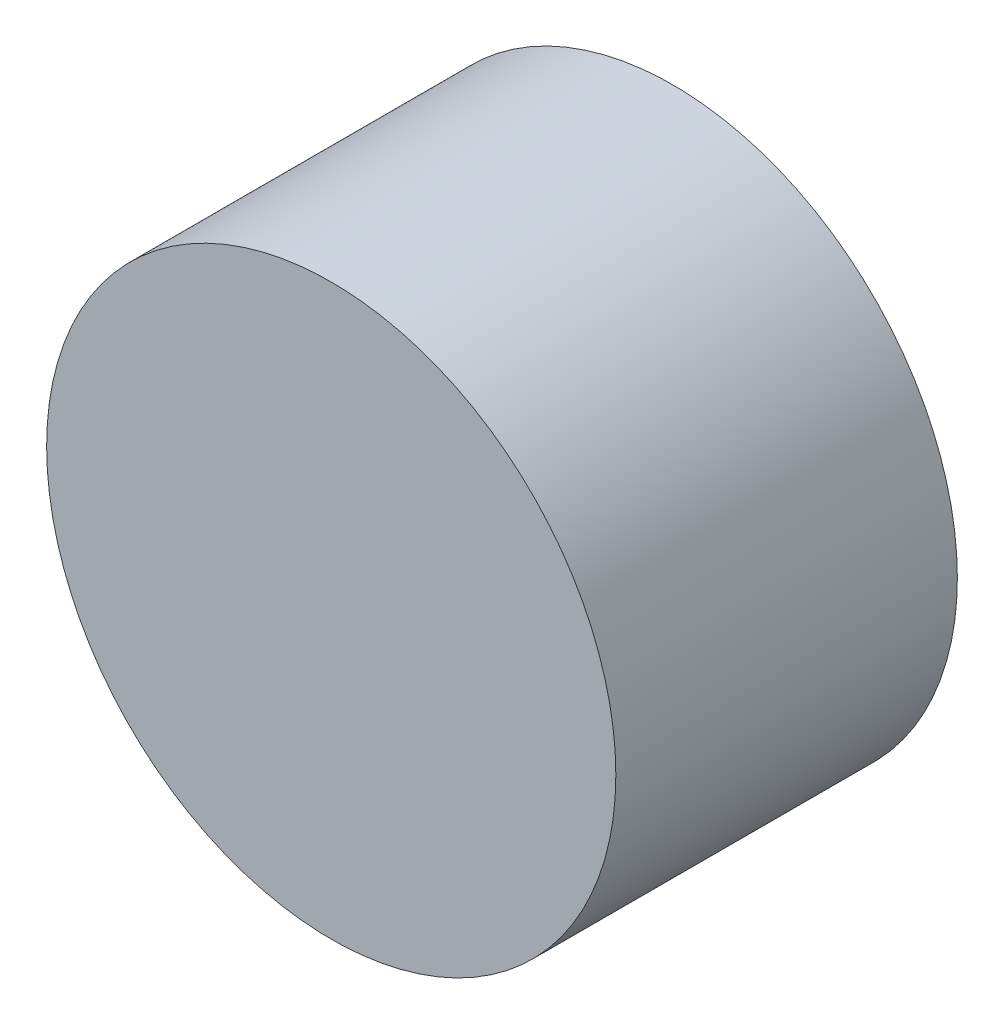
ISO-10303-21;
HEADER;
FILE_DESCRIPTION(('STEP AP214'),'2;1');
FILE_NAME('part.step','',(''),(''),'','','');
FILE_SCHEMA(('AUTOMOTIVE_DESIGN { 1 0 10303 214 1 1 1 1 }'));
ENDSEC;
DATA;
#1=APPLICATION_CONTEXT('core data for automotive mechanical design processes');
#2=APPLICATION_PROTOCOL_DEFINITION('international standard','automotive_design',2000,#1);
#3=PRODUCT_CONTEXT('',#1,'mechanical');
#4=PRODUCT('Part','Part','',(#3));
#5=PRODUCT_RELATED_PRODUCT_CATEGORY('part','',(#4));
#6=PRODUCT_DEFINITION_FORMATION('','',#4);
#7=PRODUCT_DEFINITION_CONTEXT('part definition',#1,'design');
#8=PRODUCT_DEFINITION('design','',#6,#7);
#9=PRODUCT_DEFINITION_SHAPE('','',#8);
#10=(LENGTH_UNIT() NAMED_UNIT(*) SI_UNIT(.MILLI.,.METRE.));
#11=(NAMED_UNIT(*) PLANE_ANGLE_UNIT() SI_UNIT($,.RADIAN.));
#12=(NAMED_UNIT(*) SI_UNIT($,.STERADIAN.) SOLID_ANGLE_UNIT());
#13=UNCERTAINTY_MEASURE_WITH_UNIT(LENGTH_MEASURE(1.E-05),#10,'distance_accuracy_value','');
#14=(GEOMETRIC_REPRESENTATION_CONTEXT(3) GLOBAL_UNCERTAINTY_ASSIGNED_CONTEXT((#13)) GLOBAL_UNIT_ASSIGNED_CONTEXT((#10,
#11,#12)) REPRESENTATION_CONTEXT('',''));
#15=CARTESIAN_POINT('',(0.,0.,0.));
#16=DIRECTION('',(0.,0.,1.));
#17=DIRECTION('',(1.,0.,0.));
#18=AXIS2_PLACEMENT_3D('',#15,#16,#17);
#19=CARTESIAN_POINT('',(0.,0.,3.));
#20=DIRECTION('',(0.,0.,-1.));
#21=DIRECTION('',(-1.,0.,0.));
#22=AXIS2_PLACEMENT_3D('',#19,#20,#21);
#23=CYLINDRICAL_SURFACE('',#22,2.5);
#24=CARTESIAN_POINT('',(0.,0.,3.));
#25=DIRECTION('',(0.,0.,1.));
#26=DIRECTION('',(1.,0.,0.));
#27=AXIS2_PLACEMENT_3D('',#24,#25,#26);
#28=CIRCLE('',#27,2.5);
#29=CARTESIAN_POINT('',(2.5,0.,3.));
#30=VERTEX_POINT('',#29);
#31=EDGE_CURVE('E10',#30,#30,#28,.T.);
#32=ORIENTED_EDGE('',*,*,#31,.F.);
#33=EDGE_LOOP('',(#32));
#34=FACE_BOUND('',#33,.T.);
#35=CARTESIAN_POINT('',(0.,0.,0.));
#36=DIRECTION('',(0.,0.,1.));
#37=DIRECTION('',(1.,0.,0.));
#38=AXIS2_PLACEMENT_3D('',#35,#36,#37);
#39=CIRCLE('',#38,2.5);
#40=CARTESIAN_POINT('',(2.5,0.,0.));
#41=VERTEX_POINT('',#40);
#42=EDGE_CURVE('E37',#41,#41,#39,.T.);
#43=ORIENTED_EDGE('',*,*,#42,.T.);
#44=EDGE_LOOP('',(#43));
#45=FACE_BOUND('',#44,.T.);
#46=ADVANCED_FACE('F40',(#34,#45),#23,.T.);
#47=CARTESIAN_POINT('',(0.,0.,3.));
#48=DIRECTION('',(0.,0.,1.));
#49=DIRECTION('',(1.,0.,0.));
#50=AXIS2_PLACEMENT_3D('',#47,#48,#49);
#51=PLANE('',#50);
#52=ORIENTED_EDGE('',*,*,#31,.T.);
#53=EDGE_LOOP('',(#52));
#54=FACE_BOUND('',#53,.T.);
#55=ADVANCED_FACE('F55',(#54),#51,.T.);
#56=CARTESIAN_POINT('',(0.,0.,0.));
#57=DIRECTION('',(0.,0.,1.));
#58=DIRECTION('',(1.,0.,0.));
#59=AXIS2_PLACEMENT_3D('',#56,#57,#58);
#60=PLANE('',#59);
#61=ORIENTED_EDGE('',*,*,#42,.F.);
#62=EDGE_LOOP('',(#61));
#63=FACE_BOUND('',#62,.T.);
#64=ADVANCED_FACE('F49',(#63),#60,.F.);
#65=CLOSED_SHELL('',(#46,#55,#64));
#66=MANIFOLD_SOLID_BREP('B2',#65);
#67=ADVANCED_BREP_SHAPE_REPRESENTATION('',(#18,#66),#14);
#68=SHAPE_DEFINITION_REPRESENTATION(#9,#67);
ENDSEC;
END-ISO-10303-21;
